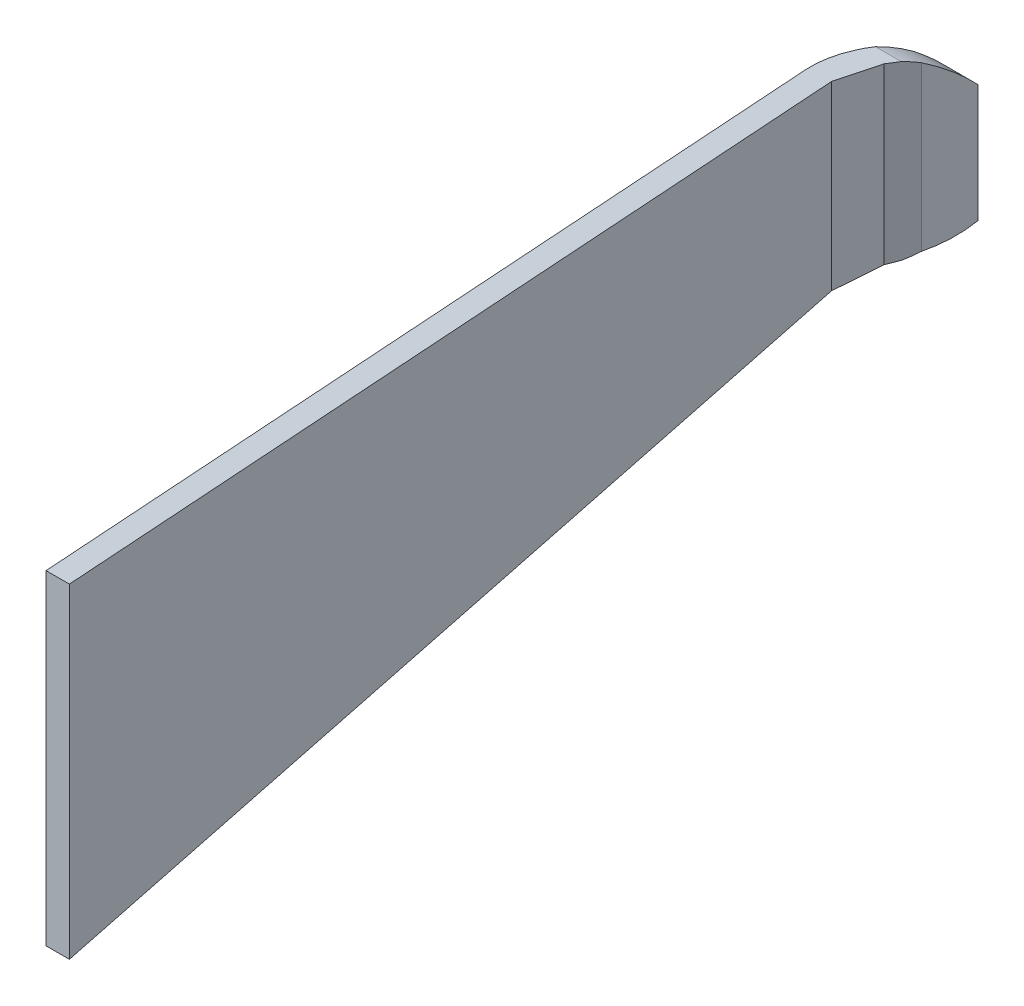
ISO-10303-21;
HEADER;
FILE_DESCRIPTION(('STEP AP214'),'2;1');
FILE_NAME('part.step','',(''),(''),'','','');
FILE_SCHEMA(('AUTOMOTIVE_DESIGN { 1 0 10303 214 1 1 1 1 }'));
ENDSEC;
DATA;
#1=APPLICATION_CONTEXT('core data for automotive mechanical design processes');
#2=APPLICATION_PROTOCOL_DEFINITION('international standard','automotive_design',2000,#1);
#3=PRODUCT_CONTEXT('',#1,'mechanical');
#4=PRODUCT('Part','Part','',(#3));
#5=PRODUCT_RELATED_PRODUCT_CATEGORY('part','',(#4));
#6=PRODUCT_DEFINITION_FORMATION('','',#4);
#7=PRODUCT_DEFINITION_CONTEXT('part definition',#1,'design');
#8=PRODUCT_DEFINITION('design','',#6,#7);
#9=PRODUCT_DEFINITION_SHAPE('','',#8);
#10=(LENGTH_UNIT() NAMED_UNIT(*) SI_UNIT(.MILLI.,.METRE.));
#11=(NAMED_UNIT(*) PLANE_ANGLE_UNIT() SI_UNIT($,.RADIAN.));
#12=(NAMED_UNIT(*) SI_UNIT($,.STERADIAN.) SOLID_ANGLE_UNIT());
#13=UNCERTAINTY_MEASURE_WITH_UNIT(LENGTH_MEASURE(1.E-05),#10,'distance_accuracy_value','');
#14=(GEOMETRIC_REPRESENTATION_CONTEXT(3) GLOBAL_UNCERTAINTY_ASSIGNED_CONTEXT((#13)) GLOBAL_UNIT_ASSIGNED_CONTEXT((#10,
#11,#12)) REPRESENTATION_CONTEXT('',''));
#15=CARTESIAN_POINT('',(0.,0.,0.));
#16=DIRECTION('',(0.,0.,1.));
#17=DIRECTION('',(1.,0.,0.));
#18=AXIS2_PLACEMENT_3D('',#15,#16,#17);
#19=CARTESIAN_POINT('',(7.35078132792632,3.,4.07403717610098));
#20=DIRECTION('',(-0.989927243377264,0.,0.141577020803138));
#21=DIRECTION('',(0.141577020803138,0.,0.989927243377264));
#22=AXIS2_PLACEMENT_3D('',#19,#20,#21);
#23=PLANE('',#22);
#24=DIRECTION('',(0.,-1.,0.));
#25=VECTOR('',#24,1.);
#26=CARTESIAN_POINT('',(7.35078132792632,3.,4.07403717610098));
#27=LINE('',#26,#25);
#28=CARTESIAN_POINT('',(7.35078132792632,2.56193240858914,4.07403717610098));
#29=VERTEX_POINT('',#28);
#30=CARTESIAN_POINT('',(7.35078132792632,0.454379680232837,4.07403717610098));
#31=VERTEX_POINT('',#30);
#32=EDGE_CURVE('E150',#29,#31,#27,.T.);
#33=ORIENTED_EDGE('',*,*,#32,.T.);
#34=DIRECTION('',(-0.141141031928354,0.0784190731359394,-0.986878745375894));
#35=VECTOR('',#34,1.);
#36=CARTESIAN_POINT('',(7.32260602317085,0.470034102296069,3.87703132296414));
#37=LINE('',#36,#35);
#38=CARTESIAN_POINT('',(6.52592616274927,0.91267573093347,-1.6934708221399));
#39=VERTEX_POINT('',#38);
#40=EDGE_CURVE('E219',#31,#39,#37,.T.);
#41=ORIENTED_EDGE('',*,*,#40,.T.);
#42=DIRECTION('',(0.,-1.,0.));
#43=VECTOR('',#42,1.);
#44=CARTESIAN_POINT('',(6.52592616274927,3.,-1.6934708221399));
#45=LINE('',#44,#43);
#46=CARTESIAN_POINT('',(6.52592616274927,2.08868051207771,-1.6934708221399));
#47=VERTEX_POINT('',#46);
#48=EDGE_CURVE('E186',#47,#39,#45,.T.);
#49=ORIENTED_EDGE('',*,*,#48,.F.);
#50=DIRECTION('',(0.141112254112829,0.0809616581179611,0.986677526679303));
#51=VECTOR('',#50,1.);
#52=CARTESIAN_POINT('',(7.355786110885,2.56480384969397,4.10903135079035));
#53=LINE('',#52,#51);
#54=EDGE_CURVE('E240',#47,#29,#53,.T.);
#55=ORIENTED_EDGE('',*,*,#54,.T.);
#56=EDGE_LOOP('',(#33,#41,#49,#55));
#57=FACE_BOUND('',#56,.T.);
#58=ADVANCED_FACE('F33',(#57),#23,.F.);
#59=CARTESIAN_POINT('',(6.52592616274927,3.,-1.6934708221399));
#60=DIRECTION('',(-0.98737019282883,0.,-0.158430118074684));
#61=DIRECTION('',(-0.158430118074684,0.,0.98737019282883));
#62=AXIS2_PLACEMENT_3D('',#59,#60,#61);
#63=PLANE('',#62);
#64=ORIENTED_EDGE('',*,*,#48,.T.);
#65=DIRECTION('',(0.157944735483248,0.0782177521172547,-0.98434518528149));
#66=VECTOR('',#65,1.);
#67=CARTESIAN_POINT('',(6.55171313828111,0.925446015766528,-1.85418073836518));
#68=LINE('',#67,#66);
#69=CARTESIAN_POINT('',(6.57292021457842,0.935948232455674,-1.98634774844809));
#70=VERTEX_POINT('',#69);
#71=EDGE_CURVE('E222',#39,#70,#68,.T.);
#72=ORIENTED_EDGE('',*,*,#71,.T.);
#73=DIRECTION('',(0.,-1.,0.));
#74=VECTOR('',#73,1.);
#75=CARTESIAN_POINT('',(6.57292021457842,3.,-1.98634774844809));
#76=LINE('',#75,#74);
#77=CARTESIAN_POINT('',(6.57292021457842,2.06464854526257,-1.98634774844809));
#78=VERTEX_POINT('',#77);
#79=EDGE_CURVE('E183',#78,#70,#76,.T.);
#80=ORIENTED_EDGE('',*,*,#79,.F.);
#81=DIRECTION('',(-0.157912696581293,0.0807538940827629,0.984145512030053));
#82=VECTOR('',#81,1.);
#83=CARTESIAN_POINT('',(6.5143049572449,2.09462340089369,-1.62104499768687));
#84=LINE('',#83,#82);
#85=EDGE_CURVE('E242',#78,#47,#84,.T.);
#86=ORIENTED_EDGE('',*,*,#85,.T.);
#87=EDGE_LOOP('',(#64,#72,#80,#86));
#88=FACE_BOUND('',#87,.T.);
#89=ADVANCED_FACE('F260',(#88),#63,.F.);
#90=CARTESIAN_POINT('',(6.57292021457842,3.,-1.98634774844809));
#91=DIRECTION('',(-0.895939139718959,0.,-0.444176831813244));
#92=DIRECTION('',(-0.444176831813244,0.,0.895939139718959));
#93=AXIS2_PLACEMENT_3D('',#90,#91,#92);
#94=PLANE('',#93);
#95=ORIENTED_EDGE('',*,*,#79,.T.);
#96=DIRECTION('',(0.4430554547321,0.0710131217126644,-0.893677235122812));
#97=VECTOR('',#96,1.);
#98=CARTESIAN_POINT('',(6.63786096125215,0.946356963684231,-2.11733827415842));
#99=LINE('',#98,#97);
#100=CARTESIAN_POINT('',(6.61025769223246,0.941932699674779,-2.06166033841834));
#101=VERTEX_POINT('',#100);
#102=EDGE_CURVE('E226',#70,#101,#99,.T.);
#103=ORIENTED_EDGE('',*,*,#102,.T.);
#104=CARTESIAN_POINT('',(6.54427728583856,1.50015307898968,-1.92857273837055));
#105=DIRECTION('',(-0.895939139718959,0.,-0.444176831813244));
#106=DIRECTION('',(0.444176831813244,0.,-0.895939139718959));
#107=AXIS2_PLACEMENT_3D('',#104,#105,#106);
#108=ELLIPSE('',#107,0.640519065349854,0.57386610038314);
#109=CARTESIAN_POINT('',(6.65342131131229,0.97019514524831,-2.14872470777698));
#110=VERTEX_POINT('',#109);
#111=EDGE_CURVE('E160',#101,#110,#108,.F.);
#112=ORIENTED_EDGE('',*,*,#111,.T.);
#113=DIRECTION('',(0.,-1.,0.));
#114=VECTOR('',#113,1.);
#115=CARTESIAN_POINT('',(6.65342131131229,3.,-2.14872470777698));
#116=LINE('',#115,#114);
#117=CARTESIAN_POINT('',(6.65342131131229,2.03011101273105,-2.14872470777698));
#118=VERTEX_POINT('',#117);
#119=EDGE_CURVE('E180',#118,#110,#116,.T.);
#120=ORIENTED_EDGE('',*,*,#119,.F.);
#121=CARTESIAN_POINT('',(6.60995432234169,2.05851899443142,-2.06104841780591));
#122=VERTEX_POINT('',#121);
#123=EDGE_CURVE('E163',#118,#122,#108,.F.);
#124=ORIENTED_EDGE('',*,*,#123,.T.);
#125=DIRECTION('',(-0.442981371431061,0.0733182732737658,0.893527803355447));
#126=VECTOR('',#125,1.);
#127=CARTESIAN_POINT('',(6.54254128146551,2.06967659172994,-1.92507108282902));
#128=LINE('',#127,#126);
#129=EDGE_CURVE('E245',#122,#78,#128,.T.);
#130=ORIENTED_EDGE('',*,*,#129,.T.);
#131=EDGE_LOOP('',(#95,#103,#112,#120,#124,#130));
#132=FACE_BOUND('',#131,.T.);
#133=ADVANCED_FACE('F262',(#132),#94,.F.);
#134=CARTESIAN_POINT('',(6.65342131131229,3.,-2.14872470777698));
#135=DIRECTION('',(-0.795083693809089,0.,-0.606499727814361));
#136=DIRECTION('',(-0.606499727814361,0.,0.79508369380909));
#137=AXIS2_PLACEMENT_3D('',#134,#135,#136);
#138=PLANE('',#137);
#139=DIRECTION('',(0.,-1.,0.));
#140=VECTOR('',#139,1.);
#141=CARTESIAN_POINT('',(6.81224832301411,3.,-2.35693711307454));
#142=LINE('',#141,#140);
#143=CARTESIAN_POINT('',(6.81224832301411,1.88202513040667,-2.35693711307454));
#144=VERTEX_POINT('',#143);
#145=CARTESIAN_POINT('',(6.81224832301411,1.1182810275727,-2.35693711307454));
#146=VERTEX_POINT('',#145);
#147=EDGE_CURVE('E177',#144,#146,#142,.T.);
#148=ORIENTED_EDGE('',*,*,#147,.F.);
#149=CARTESIAN_POINT('',(6.48548665165009,1.50015307898968,-1.92857273837055));
#150=DIRECTION('',(-0.795083693809089,0.,-0.606499727814361));
#151=DIRECTION('',(0.606499727814361,0.,-0.79508369380909));
#152=AXIS2_PLACEMENT_3D('',#149,#150,#151);
#153=ELLIPSE('',#152,0.721768167114409,0.57386610038314);
#154=EDGE_CURVE('E217',#144,#118,#153,.F.);
#155=ORIENTED_EDGE('',*,*,#154,.T.);
#156=ORIENTED_EDGE('',*,*,#119,.T.);
#157=EDGE_CURVE('E213',#110,#146,#153,.F.);
#158=ORIENTED_EDGE('',*,*,#157,.T.);
#159=EDGE_LOOP('',(#148,#155,#156,#158));
#160=FACE_BOUND('',#159,.T.);
#161=ADVANCED_FACE('F269',(#160),#138,.F.);
#162=CARTESIAN_POINT('',(6.69298576894275,3.,-2.44791207224669));
#163=DIRECTION('',(-0.606499727814359,0.,0.795083693809091));
#164=DIRECTION('',(0.795083693809091,0.,0.606499727814359));
#165=AXIS2_PLACEMENT_3D('',#162,#163,#164);
#166=PLANE('',#165);
#167=ORIENTED_EDGE('',*,*,#147,.T.);
#168=CARTESIAN_POINT('',(7.37380756816535,1.50015307898968,-1.92857273837055));
#169=DIRECTION('',(-0.606499727814359,0.,0.795083693809091));
#170=DIRECTION('',(0.795083693809091,0.,0.606499727814359));
#171=AXIS2_PLACEMENT_3D('',#168,#169,#170);
#172=ELLIPSE('',#171,0.946193500285944,0.57386610038314);
#173=CARTESIAN_POINT('',(6.69298576894275,1.25600362177537,-2.44791207224669));
#174=VERTEX_POINT('',#173);
#175=EDGE_CURVE('E211',#146,#174,#172,.F.);
#176=ORIENTED_EDGE('',*,*,#175,.T.);
#177=DIRECTION('',(0.,-1.,0.));
#178=VECTOR('',#177,1.);
#179=CARTESIAN_POINT('',(6.69298576894275,3.,-2.44791207224669));
#180=LINE('',#179,#178);
#181=CARTESIAN_POINT('',(6.69298576894275,1.74430253620399,-2.44791207224669));
#182=VERTEX_POINT('',#181);
#183=EDGE_CURVE('E174',#182,#174,#180,.T.);
#184=ORIENTED_EDGE('',*,*,#183,.F.);
#185=EDGE_CURVE('E215',#182,#144,#172,.F.);
#186=ORIENTED_EDGE('',*,*,#185,.T.);
#187=EDGE_LOOP('',(#167,#176,#184,#186));
#188=FACE_BOUND('',#187,.T.);
#189=ADVANCED_FACE('F273',(#188),#166,.F.);
#190=CARTESIAN_POINT('',(6.52542598406743,3.,-2.22825154053859));
#191=DIRECTION('',(0.795083693809088,0.,0.606499727814362));
#192=DIRECTION('',(0.606499727814362,0.,-0.795083693809089));
#193=AXIS2_PLACEMENT_3D('',#190,#191,#192);
#194=PLANE('',#193);
#195=ORIENTED_EDGE('',*,*,#183,.T.);
#196=CARTESIAN_POINT('',(6.29682726752742,1.50015307898968,-1.92857273837055));
#197=DIRECTION('',(0.795083693809088,0.,0.606499727814362));
#198=DIRECTION('',(0.606499727814362,0.,-0.795083693809089));
#199=AXIS2_PLACEMENT_3D('',#196,#197,#198);
#200=ELLIPSE('',#199,0.72176816711441,0.57386610038314);
#201=CARTESIAN_POINT('',(6.52542598406743,1.01075046692055,-2.22825154053859));
#202=VERTEX_POINT('',#201);
#203=EDGE_CURVE('E208',#174,#202,#200,.F.);
#204=ORIENTED_EDGE('',*,*,#203,.T.);
#205=DIRECTION('',(0.,-1.,0.));
#206=VECTOR('',#205,1.);
#207=CARTESIAN_POINT('',(6.52542598406743,3.,-2.22825154053859));
#208=LINE('',#207,#206);
#209=CARTESIAN_POINT('',(6.52542598406743,1.98955569105881,-2.22825154053859));
#210=VERTEX_POINT('',#209);
#211=EDGE_CURVE('E171',#210,#202,#208,.T.);
#212=ORIENTED_EDGE('',*,*,#211,.F.);
#213=EDGE_CURVE('E206',#210,#182,#200,.F.);
#214=ORIENTED_EDGE('',*,*,#213,.T.);
#215=EDGE_LOOP('',(#195,#204,#212,#214));
#216=FACE_BOUND('',#215,.T.);
#217=ADVANCED_FACE('F205',(#216),#194,.F.);
#218=CARTESIAN_POINT('',(6.43852934362058,3.,-2.05297427322008));
#219=DIRECTION('',(0.895939139718962,0.,0.444176831813239));
#220=DIRECTION('',(0.444176831813239,0.,-0.895939139718962));
#221=AXIS2_PLACEMENT_3D('',#218,#219,#220);
#222=PLANE('',#221);
#223=CARTESIAN_POINT('',(6.37685519950461,1.50015307898968,-1.92857273837055));
#224=DIRECTION('',(0.895939139718962,0.,0.444176831813239));
#225=DIRECTION('',(0.444176831813239,0.,-0.895939139718962));
#226=AXIS2_PLACEMENT_3D('',#223,#224,#225);
#227=ELLIPSE('',#226,0.640519065349853,0.57386610038314);
#228=CARTESIAN_POINT('',(6.4428356058985,0.941932699674779,-2.06166033841834));
#229=VERTEX_POINT('',#228);
#230=EDGE_CURVE('E11',#202,#229,#227,.F.);
#231=ORIENTED_EDGE('',*,*,#230,.T.);
#232=DIRECTION('',(-0.443055454732096,-0.0710131217126646,0.893677235122815));
#233=VECTOR('',#232,1.);
#234=CARTESIAN_POINT('',(6.5033035183854,0.951624523087131,-2.18362881046347));
#235=LINE('',#234,#233);
#236=CARTESIAN_POINT('',(6.43852934362058,0.941242490076855,-2.05297427322008));
#237=VERTEX_POINT('',#236);
#238=EDGE_CURVE('E231',#229,#237,#235,.T.);
#239=ORIENTED_EDGE('',*,*,#238,.T.);
#240=DIRECTION('',(0.,-1.,0.));
#241=VECTOR('',#240,1.);
#242=CARTESIAN_POINT('',(6.43852934362058,3.,-2.05297427322008));
#243=LINE('',#242,#241);
#244=CARTESIAN_POINT('',(6.43852934362058,2.05918151700428,-2.05297427322008));
#245=VERTEX_POINT('',#244);
#246=EDGE_CURVE('E168',#245,#237,#243,.T.);
#247=ORIENTED_EDGE('',*,*,#246,.F.);
#248=DIRECTION('',(0.442981371431056,-0.073318273273766,-0.893527803355449));
#249=VECTOR('',#248,1.);
#250=CARTESIAN_POINT('',(6.40797284892379,2.06423895186035,-1.99133945210681));
#251=LINE('',#250,#249);
#252=CARTESIAN_POINT('',(6.44253223600774,2.05851899443142,-2.06104841780591));
#253=VERTEX_POINT('',#252);
#254=EDGE_CURVE('E198',#245,#253,#251,.T.);
#255=ORIENTED_EDGE('',*,*,#254,.T.);
#256=EDGE_CURVE('E36',#253,#210,#227,.F.);
#257=ORIENTED_EDGE('',*,*,#256,.T.);
#258=ORIENTED_EDGE('',*,*,#211,.T.);
#259=EDGE_LOOP('',(#231,#239,#247,#255,#257,#258));
#260=FACE_BOUND('',#259,.T.);
#261=ADVANCED_FACE('F196',(#260),#222,.F.);
#262=CARTESIAN_POINT('',(7.0208897844379,3.,-1.76425933254147));
#263=DIRECTION('',(0.,-1.,0.));
#264=DIRECTION('',(0.,0.,-1.));
#265=AXIS2_PLACEMENT_3D('',#262,#263,#264);
#266=CYLINDRICAL_SURFACE('',#265,0.649999999999999);
#267=ORIENTED_EDGE('',*,*,#246,.T.);
#268=CARTESIAN_POINT('',(7.0208897844379,0.918300707051737,-1.76425933254147));
#269=DIRECTION('',(0.,0.996857790796168,0.0792120251539112));
#270=DIRECTION('',(0.,-0.0792120251539112,0.996857790796168));
#271=AXIS2_PLACEMENT_3D('',#268,#269,#270);
#272=ELLIPSE('',#271,0.652048873973146,0.649999999999999);
#273=CARTESIAN_POINT('',(6.37743707624268,0.91098823809799,-1.67223426901943));
#274=VERTEX_POINT('',#273);
#275=EDGE_CURVE('E234',#237,#274,#272,.T.);
#276=ORIENTED_EDGE('',*,*,#275,.T.);
#277=DIRECTION('',(0.,-1.,0.));
#278=VECTOR('',#277,1.);
#279=CARTESIAN_POINT('',(6.37743707624268,3.,-1.67223426901943));
#280=LINE('',#279,#278);
#281=CARTESIAN_POINT('',(6.37743707624268,2.09042307386396,-1.67223426901943));
#282=VERTEX_POINT('',#281);
#283=EDGE_CURVE('E158',#282,#274,#280,.T.);
#284=ORIENTED_EDGE('',*,*,#283,.F.);
#285=CARTESIAN_POINT('',(7.0208897844379,2.08287197279021,-1.76425933254147));
#286=DIRECTION('',(0.,-0.996650407454908,0.0817799811687791));
#287=DIRECTION('',(0.,-0.0817799811687791,-0.996650407454908));
#288=AXIS2_PLACEMENT_3D('',#285,#286,#287);
#289=ELLIPSE('',#288,0.652184552515128,0.649999999999999);
#290=EDGE_CURVE('E249',#282,#245,#289,.T.);
#291=ORIENTED_EDGE('',*,*,#290,.T.);
#292=EDGE_LOOP('',(#267,#276,#284,#291));
#293=FACE_BOUND('',#292,.T.);
#294=ADVANCED_FACE('F300',(#293),#266,.T.);
#295=CARTESIAN_POINT('',(7.19925504051124,3.,4.07403717610098));
#296=DIRECTION('',(0.989927243377264,0.,-0.141577020803138));
#297=DIRECTION('',(-0.141577020803138,0.,-0.989927243377264));
#298=AXIS2_PLACEMENT_3D('',#295,#296,#297);
#299=PLANE('',#298);
#300=ORIENTED_EDGE('',*,*,#283,.T.);
#301=DIRECTION('',(0.141141031928354,-0.0784190731359394,0.986878745375894));
#302=VECTOR('',#301,1.);
#303=CARTESIAN_POINT('',(7.17107973575577,0.470034102296069,3.87703132296414));
#304=LINE('',#303,#302);
#305=CARTESIAN_POINT('',(7.19925504051124,0.454379680232837,4.07403717610098));
#306=VERTEX_POINT('',#305);
#307=EDGE_CURVE('E237',#274,#306,#304,.T.);
#308=ORIENTED_EDGE('',*,*,#307,.T.);
#309=DIRECTION('',(0.,-1.,0.));
#310=VECTOR('',#309,1.);
#311=CARTESIAN_POINT('',(7.19925504051124,3.,4.07403717610098));
#312=LINE('',#311,#310);
#313=CARTESIAN_POINT('',(7.19925504051124,2.56193240858914,4.07403717610098));
#314=VERTEX_POINT('',#313);
#315=EDGE_CURVE('E154',#314,#306,#312,.T.);
#316=ORIENTED_EDGE('',*,*,#315,.F.);
#317=DIRECTION('',(-0.141112254112829,-0.0809616581179611,-0.986677526679303));
#318=VECTOR('',#317,1.);
#319=CARTESIAN_POINT('',(7.20425982346992,2.56480384969397,4.10903135079035));
#320=LINE('',#319,#318);
#321=EDGE_CURVE('E55',#314,#282,#320,.T.);
#322=ORIENTED_EDGE('',*,*,#321,.T.);
#323=EDGE_LOOP('',(#300,#308,#316,#322));
#324=FACE_BOUND('',#323,.T.);
#325=ADVANCED_FACE('F303',(#324),#299,.F.);
#326=CARTESIAN_POINT('',(7.35078132792632,0.,4.07403717610098));
#327=DIRECTION('',(1.,0.,0.));
#328=DIRECTION('',(0.,0.,-1.));
#329=AXIS2_PLACEMENT_3D('',#326,#327,#328);
#330=PLANE('',#329);
#331=DIRECTION('',(0.,-0.0792120251539112,0.996857790796168));
#332=VECTOR('',#331,1.);
#333=CARTESIAN_POINT('',(7.35078132792632,0.431685602091719,4.35963483069894));
#334=LINE('',#333,#332);
#335=CARTESIAN_POINT('',(7.35078132792632,0.454300218522366,4.07503717610098));
#336=VERTEX_POINT('',#335);
#337=EDGE_CURVE('E151',#31,#336,#334,.T.);
#338=ORIENTED_EDGE('',*,*,#337,.F.);
#339=ORIENTED_EDGE('',*,*,#32,.F.);
#340=DIRECTION('',(0.,-0.0817799811687791,-0.996650407454908));
#341=VECTOR('',#340,1.);
#342=CARTESIAN_POINT('',(7.35078132792632,2.54999934367337,3.92860923835253));
#343=LINE('',#342,#341);
#344=CARTESIAN_POINT('',(7.35078132792632,2.56201446342056,4.07503717610098));
#345=VERTEX_POINT('',#344);
#346=EDGE_CURVE('E134',#345,#29,#343,.T.);
#347=ORIENTED_EDGE('',*,*,#346,.F.);
#348=DIRECTION('',(0.,1.,0.));
#349=VECTOR('',#348,1.);
#350=CARTESIAN_POINT('',(7.35078132792632,0.,4.07503717610098));
#351=LINE('',#350,#349);
#352=EDGE_CURVE('E148',#336,#345,#351,.T.);
#353=ORIENTED_EDGE('',*,*,#352,.F.);
#354=EDGE_LOOP('',(#338,#339,#347,#353));
#355=FACE_BOUND('',#354,.T.);
#356=ADVANCED_FACE('F147',(#355),#330,.T.);
#357=CARTESIAN_POINT('',(7.35078132792632,0.,4.07503717610098));
#358=DIRECTION('',(0.,0.,1.));
#359=DIRECTION('',(1.,0.,0.));
#360=AXIS2_PLACEMENT_3D('',#357,#358,#359);
#361=PLANE('',#360);
#362=DIRECTION('',(-1.,0.,0.));
#363=VECTOR('',#362,1.);
#364=CARTESIAN_POINT('',(7.35078132792632,0.454300218522366,4.07503717610098));
#365=LINE('',#364,#363);
#366=CARTESIAN_POINT('',(7.19925504051124,0.454300218522366,4.07503717610098));
#367=VERTEX_POINT('',#366);
#368=EDGE_CURVE('E47',#336,#367,#365,.T.);
#369=ORIENTED_EDGE('',*,*,#368,.F.);
#370=ORIENTED_EDGE('',*,*,#352,.T.);
#371=DIRECTION('',(1.,0.,0.));
#372=VECTOR('',#371,1.);
#373=CARTESIAN_POINT('',(7.35078132792632,2.56201446342056,4.07503717610098));
#374=LINE('',#373,#372);
#375=CARTESIAN_POINT('',(7.19925504051124,2.56201446342056,4.07503717610098));
#376=VERTEX_POINT('',#375);
#377=EDGE_CURVE('E131',#376,#345,#374,.T.);
#378=ORIENTED_EDGE('',*,*,#377,.F.);
#379=DIRECTION('',(0.,1.,0.));
#380=VECTOR('',#379,1.);
#381=CARTESIAN_POINT('',(7.19925504051124,0.,4.07503717610098));
#382=LINE('',#381,#380);
#383=EDGE_CURVE('E155',#367,#376,#382,.T.);
#384=ORIENTED_EDGE('',*,*,#383,.F.);
#385=EDGE_LOOP('',(#369,#370,#378,#384));
#386=FACE_BOUND('',#385,.T.);
#387=ADVANCED_FACE('F153',(#386),#361,.T.);
#388=CARTESIAN_POINT('',(7.19925504051124,0.,4.07503717610098));
#389=DIRECTION('',(-1.,0.,0.));
#390=DIRECTION('',(0.,0.,1.));
#391=AXIS2_PLACEMENT_3D('',#388,#389,#390);
#392=PLANE('',#391);
#393=DIRECTION('',(0.,0.0792120251539112,-0.996857790796168));
#394=VECTOR('',#393,1.);
#395=CARTESIAN_POINT('',(7.19925504051124,0.45144969139,4.11091014077085));
#396=LINE('',#395,#394);
#397=EDGE_CURVE('E190',#367,#306,#396,.T.);
#398=ORIENTED_EDGE('',*,*,#397,.F.);
#399=ORIENTED_EDGE('',*,*,#383,.T.);
#400=DIRECTION('',(0.,0.0817799811687791,0.996650407454908));
#401=VECTOR('',#400,1.);
#402=CARTESIAN_POINT('',(7.19925504051124,2.54487979953995,3.86621749316457));
#403=LINE('',#402,#401);
#404=EDGE_CURVE('E136',#314,#376,#403,.T.);
#405=ORIENTED_EDGE('',*,*,#404,.F.);
#406=ORIENTED_EDGE('',*,*,#315,.T.);
#407=EDGE_LOOP('',(#398,#399,#405,#406));
#408=FACE_BOUND('',#407,.T.);
#409=ADVANCED_FACE('F308',(#408),#392,.T.);
#410=CARTESIAN_POINT('',(-2.64921867207368,2.54999934367337,3.92860923835253));
#411=DIRECTION('',(0.,-0.996650407454908,0.0817799811687791));
#412=DIRECTION('',(0.,-0.0817799811687791,-0.996650407454908));
#413=AXIS2_PLACEMENT_3D('',#410,#411,#412);
#414=PLANE('',#413);
#415=ORIENTED_EDGE('',*,*,#85,.F.);
#416=ORIENTED_EDGE('',*,*,#129,.F.);
#417=DIRECTION('',(1.,0.,0.));
#418=VECTOR('',#417,1.);
#419=CARTESIAN_POINT('',(-2.64921867207368,2.05851899443142,-2.06104841780591));
#420=LINE('',#419,#418);
#421=EDGE_CURVE('E253',#253,#122,#420,.T.);
#422=ORIENTED_EDGE('',*,*,#421,.F.);
#423=ORIENTED_EDGE('',*,*,#254,.F.);
#424=ORIENTED_EDGE('',*,*,#290,.F.);
#425=ORIENTED_EDGE('',*,*,#321,.F.);
#426=ORIENTED_EDGE('',*,*,#404,.T.);
#427=ORIENTED_EDGE('',*,*,#377,.T.);
#428=ORIENTED_EDGE('',*,*,#346,.T.);
#429=ORIENTED_EDGE('',*,*,#54,.F.);
#430=EDGE_LOOP('',(#415,#416,#422,#423,#424,#425,#426,#427,#428,#429));
#431=FACE_BOUND('',#430,.T.);
#432=ADVANCED_FACE('F133',(#431),#414,.F.);
#433=CARTESIAN_POINT('',(-2.64921867207368,1.50015307898968,-1.92857273837055));
#434=DIRECTION('',(1.,0.,0.));
#435=DIRECTION('',(0.,0.,-1.));
#436=AXIS2_PLACEMENT_3D('',#433,#434,#435);
#437=CYLINDRICAL_SURFACE('',#436,0.57386610038314);
#438=ORIENTED_EDGE('',*,*,#154,.F.);
#439=ORIENTED_EDGE('',*,*,#185,.F.);
#440=ORIENTED_EDGE('',*,*,#213,.F.);
#441=ORIENTED_EDGE('',*,*,#256,.F.);
#442=ORIENTED_EDGE('',*,*,#421,.T.);
#443=ORIENTED_EDGE('',*,*,#123,.F.);
#444=EDGE_LOOP('',(#438,#439,#440,#441,#442,#443));
#445=FACE_BOUND('',#444,.T.);
#446=ADVANCED_FACE('F265',(#445),#437,.T.);
#447=DIRECTION('',(1.,0.,0.));
#448=VECTOR('',#447,1.);
#449=CARTESIAN_POINT('',(-2.64921867207368,0.941932699674779,-2.06166033841834));
#450=LINE('',#449,#448);
#451=EDGE_CURVE('E141',#229,#101,#450,.T.);
#452=ORIENTED_EDGE('',*,*,#451,.F.);
#453=ORIENTED_EDGE('',*,*,#230,.F.);
#454=ORIENTED_EDGE('',*,*,#203,.F.);
#455=ORIENTED_EDGE('',*,*,#175,.F.);
#456=ORIENTED_EDGE('',*,*,#157,.F.);
#457=ORIENTED_EDGE('',*,*,#111,.F.);
#458=EDGE_LOOP('',(#452,#453,#454,#455,#456,#457));
#459=FACE_BOUND('',#458,.T.);
#460=ADVANCED_FACE('F274',(#459),#437,.T.);
#461=CARTESIAN_POINT('',(-2.64921867207368,0.431685602091719,4.35963483069894));
#462=DIRECTION('',(0.,0.996857790796168,0.0792120251539112));
#463=DIRECTION('',(0.,-0.0792120251539112,0.996857790796168));
#464=AXIS2_PLACEMENT_3D('',#461,#462,#463);
#465=PLANE('',#464);
#466=ORIENTED_EDGE('',*,*,#337,.T.);
#467=ORIENTED_EDGE('',*,*,#368,.T.);
#468=ORIENTED_EDGE('',*,*,#397,.T.);
#469=ORIENTED_EDGE('',*,*,#307,.F.);
#470=ORIENTED_EDGE('',*,*,#275,.F.);
#471=ORIENTED_EDGE('',*,*,#238,.F.);
#472=ORIENTED_EDGE('',*,*,#451,.T.);
#473=ORIENTED_EDGE('',*,*,#102,.F.);
#474=ORIENTED_EDGE('',*,*,#71,.F.);
#475=ORIENTED_EDGE('',*,*,#40,.F.);
#476=EDGE_LOOP('',(#466,#467,#468,#469,#470,#471,#472,#473,#474,#475));
#477=FACE_BOUND('',#476,.T.);
#478=ADVANCED_FACE('F257',(#477),#465,.F.);
#479=CLOSED_SHELL('',(#58,#89,#133,#161,#189,#217,#261,#294,#325,#356,#387,#409,#432,#446,#460,#478));
#480=MANIFOLD_SOLID_BREP('B2',#479);
#481=ADVANCED_BREP_SHAPE_REPRESENTATION('',(#18,#480),#14);
#482=SHAPE_DEFINITION_REPRESENTATION(#9,#481);
ENDSEC;
END-ISO-10303-21;
